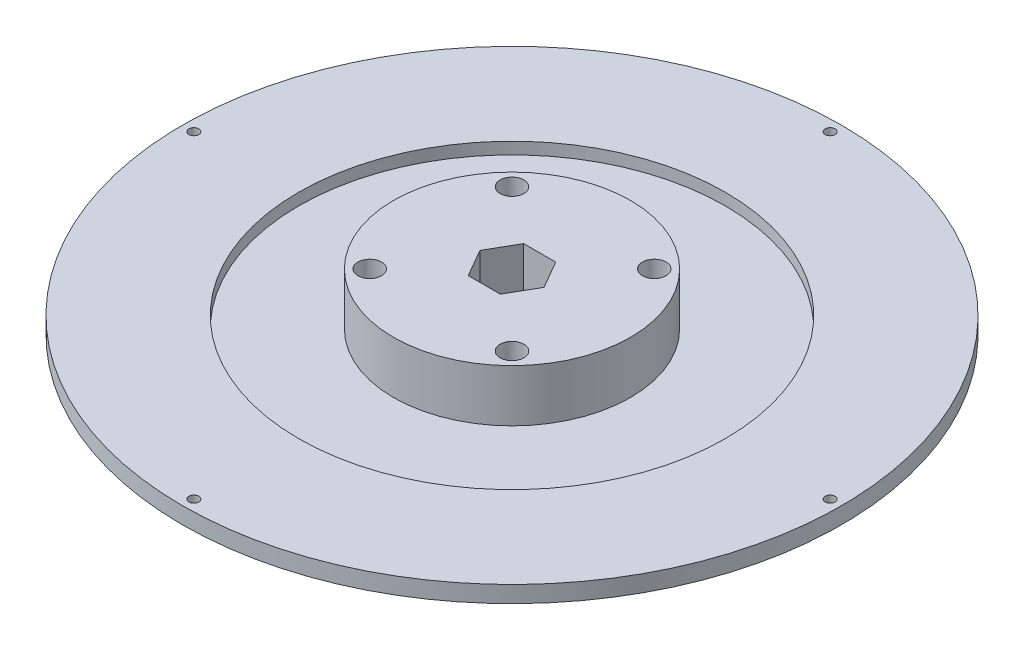
ISO-10303-21;
HEADER;
FILE_DESCRIPTION(('STEP AP214'),'2;1');
FILE_NAME('part.step','',(''),(''),'','','');
FILE_SCHEMA(('AUTOMOTIVE_DESIGN { 1 0 10303 214 1 1 1 1 }'));
ENDSEC;
DATA;
#1=APPLICATION_CONTEXT('core data for automotive mechanical design processes');
#2=APPLICATION_PROTOCOL_DEFINITION('international standard','automotive_design',2000,#1);
#3=PRODUCT_CONTEXT('',#1,'mechanical');
#4=PRODUCT('Part','Part','',(#3));
#5=PRODUCT_RELATED_PRODUCT_CATEGORY('part','',(#4));
#6=PRODUCT_DEFINITION_FORMATION('','',#4);
#7=PRODUCT_DEFINITION_CONTEXT('part definition',#1,'design');
#8=PRODUCT_DEFINITION('design','',#6,#7);
#9=PRODUCT_DEFINITION_SHAPE('','',#8);
#10=(LENGTH_UNIT() NAMED_UNIT(*) SI_UNIT(.MILLI.,.METRE.));
#11=(NAMED_UNIT(*) PLANE_ANGLE_UNIT() SI_UNIT($,.RADIAN.));
#12=(NAMED_UNIT(*) SI_UNIT($,.STERADIAN.) SOLID_ANGLE_UNIT());
#13=UNCERTAINTY_MEASURE_WITH_UNIT(LENGTH_MEASURE(1.E-05),#10,'distance_accuracy_value','');
#14=(GEOMETRIC_REPRESENTATION_CONTEXT(3) GLOBAL_UNCERTAINTY_ASSIGNED_CONTEXT((#13)) GLOBAL_UNIT_ASSIGNED_CONTEXT((#10,
#11,#12)) REPRESENTATION_CONTEXT('',''));
#15=CARTESIAN_POINT('',(0.,0.,0.));
#16=DIRECTION('',(0.,0.,1.));
#17=DIRECTION('',(1.,0.,0.));
#18=AXIS2_PLACEMENT_3D('',#15,#16,#17);
#19=CARTESIAN_POINT('',(0.,6.,0.));
#20=DIRECTION('',(0.,1.,0.));
#21=DIRECTION('',(0.,0.,1.));
#22=AXIS2_PLACEMENT_3D('',#19,#20,#21);
#23=CYLINDRICAL_SURFACE('',#22,69.5);
#24=CARTESIAN_POINT('',(0.,11.,0.));
#25=DIRECTION('',(0.,1.,0.));
#26=DIRECTION('',(0.,0.,1.));
#27=AXIS2_PLACEMENT_3D('',#24,#25,#26);
#28=CIRCLE('',#27,69.5);
#29=CARTESIAN_POINT('',(0.,11.,69.5));
#30=VERTEX_POINT('',#29);
#31=EDGE_CURVE('E191',#30,#30,#28,.T.);
#32=ORIENTED_EDGE('',*,*,#31,.T.);
#33=EDGE_LOOP('',(#32));
#34=FACE_BOUND('',#33,.T.);
#35=CARTESIAN_POINT('',(0.,14.5,0.));
#36=DIRECTION('',(0.,1.,0.));
#37=DIRECTION('',(0.,0.,1.));
#38=AXIS2_PLACEMENT_3D('',#35,#36,#37);
#39=CIRCLE('',#38,69.5);
#40=CARTESIAN_POINT('',(0.,14.5,69.5));
#41=VERTEX_POINT('',#40);
#42=EDGE_CURVE('E61',#41,#41,#39,.T.);
#43=ORIENTED_EDGE('',*,*,#42,.F.);
#44=EDGE_LOOP('',(#43));
#45=FACE_BOUND('',#44,.T.);
#46=ADVANCED_FACE('F50',(#34,#45),#23,.T.);
#47=CARTESIAN_POINT('',(0.,14.5,0.));
#48=DIRECTION('',(0.,1.,0.));
#49=DIRECTION('',(0.,0.,1.));
#50=AXIS2_PLACEMENT_3D('',#47,#48,#49);
#51=PLANE('',#50);
#52=CARTESIAN_POINT('',(-67.1,14.5,0.));
#53=DIRECTION('',(0.,1.,0.));
#54=DIRECTION('',(0.,0.,1.));
#55=AXIS2_PLACEMENT_3D('',#52,#53,#54);
#56=CIRCLE('',#55,1.04999999999999);
#57=CARTESIAN_POINT('',(-67.1,14.5,1.05));
#58=VERTEX_POINT('',#57);
#59=EDGE_CURVE('E192',#58,#58,#56,.T.);
#60=ORIENTED_EDGE('',*,*,#59,.F.);
#61=EDGE_LOOP('',(#60));
#62=FACE_BOUND('',#61,.T.);
#63=CARTESIAN_POINT('',(2.26061017814095E-13,14.5,-67.1));
#64=DIRECTION('',(0.,1.,0.));
#65=DIRECTION('',(0.,0.,1.));
#66=AXIS2_PLACEMENT_3D('',#63,#64,#65);
#67=CIRCLE('',#66,1.04999999999999);
#68=CARTESIAN_POINT('',(2.26061017814095E-13,14.5,-66.05));
#69=VERTEX_POINT('',#68);
#70=EDGE_CURVE('E200',#69,#69,#67,.T.);
#71=ORIENTED_EDGE('',*,*,#70,.F.);
#72=EDGE_LOOP('',(#71));
#73=FACE_BOUND('',#72,.T.);
#74=CARTESIAN_POINT('',(67.1,14.5,4.60339415650469E-13));
#75=DIRECTION('',(0.,1.,0.));
#76=DIRECTION('',(0.,0.,1.));
#77=AXIS2_PLACEMENT_3D('',#74,#75,#76);
#78=CIRCLE('',#77,1.04999999999999);
#79=CARTESIAN_POINT('',(67.1,14.5,1.05000000000045));
#80=VERTEX_POINT('',#79);
#81=EDGE_CURVE('E208',#80,#80,#78,.T.);
#82=ORIENTED_EDGE('',*,*,#81,.F.);
#83=EDGE_LOOP('',(#82));
#84=FACE_BOUND('',#83,.T.);
#85=CARTESIAN_POINT('',(-6.94617813486844E-13,14.5,67.1));
#86=DIRECTION('',(0.,1.,0.));
#87=DIRECTION('',(0.,0.,1.));
#88=AXIS2_PLACEMENT_3D('',#85,#86,#87);
#89=CIRCLE('',#88,1.04999999999999);
#90=CARTESIAN_POINT('',(-6.94617813486844E-13,14.5,68.15));
#91=VERTEX_POINT('',#90);
#92=EDGE_CURVE('E216',#91,#91,#89,.T.);
#93=ORIENTED_EDGE('',*,*,#92,.F.);
#94=EDGE_LOOP('',(#93));
#95=FACE_BOUND('',#94,.T.);
#96=ORIENTED_EDGE('',*,*,#42,.T.);
#97=EDGE_LOOP('',(#96));
#98=FACE_BOUND('',#97,.T.);
#99=CARTESIAN_POINT('',(0.,14.5,0.));
#100=DIRECTION('',(0.,1.,0.));
#101=DIRECTION('',(0.,0.,1.));
#102=AXIS2_PLACEMENT_3D('',#99,#100,#101);
#103=CIRCLE('',#102,45.);
#104=CARTESIAN_POINT('',(0.,14.5,45.));
#105=VERTEX_POINT('',#104);
#106=EDGE_CURVE('E220',#105,#105,#103,.T.);
#107=ORIENTED_EDGE('',*,*,#106,.F.);
#108=EDGE_LOOP('',(#107));
#109=FACE_BOUND('',#108,.T.);
#110=ADVANCED_FACE('F290',(#62,#73,#84,#95,#98,#109),#51,.T.);
#111=CARTESIAN_POINT('',(0.,14.,0.));
#112=DIRECTION('',(0.,-1.,0.));
#113=DIRECTION('',(0.,0.,-1.));
#114=AXIS2_PLACEMENT_3D('',#111,#112,#113);
#115=CYLINDRICAL_SURFACE('',#114,45.);
#116=ORIENTED_EDGE('',*,*,#106,.T.);
#117=EDGE_LOOP('',(#116));
#118=FACE_BOUND('',#117,.T.);
#119=CARTESIAN_POINT('',(0.,12.,0.));
#120=DIRECTION('',(0.,1.,0.));
#121=DIRECTION('',(0.,0.,1.));
#122=AXIS2_PLACEMENT_3D('',#119,#120,#121);
#123=CIRCLE('',#122,45.);
#124=CARTESIAN_POINT('',(0.,12.,45.));
#125=VERTEX_POINT('',#124);
#126=EDGE_CURVE('E12',#125,#125,#123,.F.);
#127=ORIENTED_EDGE('',*,*,#126,.T.);
#128=EDGE_LOOP('',(#127));
#129=FACE_BOUND('',#128,.T.);
#130=ADVANCED_FACE('F285',(#118,#129),#115,.F.);
#131=CARTESIAN_POINT('',(0.,12.,0.));
#132=DIRECTION('',(0.,1.,0.));
#133=DIRECTION('',(0.,0.,1.));
#134=AXIS2_PLACEMENT_3D('',#131,#132,#133);
#135=PLANE('',#134);
#136=CARTESIAN_POINT('',(0.,12.,0.));
#137=DIRECTION('',(0.,1.,0.));
#138=DIRECTION('',(0.,0.,1.));
#139=AXIS2_PLACEMENT_3D('',#136,#137,#138);
#140=CIRCLE('',#139,25.);
#141=CARTESIAN_POINT('',(0.,12.,25.));
#142=VERTEX_POINT('',#141);
#143=EDGE_CURVE('E177',#142,#142,#140,.T.);
#144=ORIENTED_EDGE('',*,*,#143,.F.);
#145=EDGE_LOOP('',(#144));
#146=FACE_BOUND('',#145,.T.);
#147=ORIENTED_EDGE('',*,*,#126,.F.);
#148=EDGE_LOOP('',(#147));
#149=FACE_BOUND('',#148,.T.);
#150=ADVANCED_FACE('F282',(#146,#149),#135,.T.);
#151=CARTESIAN_POINT('',(0.,11.,0.));
#152=DIRECTION('',(0.,1.,0.));
#153=DIRECTION('',(0.,0.,1.));
#154=AXIS2_PLACEMENT_3D('',#151,#152,#153);
#155=PLANE('',#154);
#156=DIRECTION('',(0.5,0.,-0.866025403784439));
#157=VECTOR('',#156,1.);
#158=CARTESIAN_POINT('',(5.06624861213896,11.,2.925));
#159=LINE('',#158,#157);
#160=CARTESIAN_POINT('',(3.3774990747593,11.,5.85));
#161=VERTEX_POINT('',#160);
#162=CARTESIAN_POINT('',(6.75499814951861,11.,0.));
#163=VERTEX_POINT('',#162);
#164=EDGE_CURVE('E117',#161,#163,#159,.T.);
#165=ORIENTED_EDGE('',*,*,#164,.T.);
#166=DIRECTION('',(-0.499999999999999,0.,-0.866025403784439));
#167=VECTOR('',#166,1.);
#168=CARTESIAN_POINT('',(5.06624861213896,11.,-2.92499999999999));
#169=LINE('',#168,#167);
#170=CARTESIAN_POINT('',(3.37749907475931,11.,-5.85));
#171=VERTEX_POINT('',#170);
#172=EDGE_CURVE('E108',#163,#171,#169,.T.);
#173=ORIENTED_EDGE('',*,*,#172,.T.);
#174=DIRECTION('',(-1.,0.,0.));
#175=VECTOR('',#174,1.);
#176=CARTESIAN_POINT('',(0.,11.,-5.85));
#177=LINE('',#176,#175);
#178=CARTESIAN_POINT('',(-3.37749907475931,11.,-5.85));
#179=VERTEX_POINT('',#178);
#180=EDGE_CURVE('E120',#171,#179,#177,.T.);
#181=ORIENTED_EDGE('',*,*,#180,.T.);
#182=DIRECTION('',(-0.5,0.,0.866025403784439));
#183=VECTOR('',#182,1.);
#184=CARTESIAN_POINT('',(-5.06624861213897,11.,-2.925));
#185=LINE('',#184,#183);
#186=CARTESIAN_POINT('',(-6.75499814951862,11.,0.));
#187=VERTEX_POINT('',#186);
#188=EDGE_CURVE('E70',#179,#187,#185,.T.);
#189=ORIENTED_EDGE('',*,*,#188,.T.);
#190=DIRECTION('',(0.499999999999999,0.,0.866025403784439));
#191=VECTOR('',#190,1.);
#192=CARTESIAN_POINT('',(-5.06624861213897,11.,2.925));
#193=LINE('',#192,#191);
#194=CARTESIAN_POINT('',(-3.37749907475932,11.,5.85));
#195=VERTEX_POINT('',#194);
#196=EDGE_CURVE('E139',#187,#195,#193,.T.);
#197=ORIENTED_EDGE('',*,*,#196,.T.);
#198=DIRECTION('',(1.,0.,0.));
#199=VECTOR('',#198,1.);
#200=CARTESIAN_POINT('',(0.,11.,5.85));
#201=LINE('',#200,#199);
#202=EDGE_CURVE('E244',#195,#161,#201,.T.);
#203=ORIENTED_EDGE('',*,*,#202,.T.);
#204=EDGE_LOOP('',(#165,#173,#181,#189,#197,#203));
#205=FACE_BOUND('',#204,.T.);
#206=CARTESIAN_POINT('',(-15.,11.,15.));
#207=DIRECTION('',(0.,1.,0.));
#208=DIRECTION('',(0.,0.,1.));
#209=AXIS2_PLACEMENT_3D('',#206,#207,#208);
#210=CIRCLE('',#209,2.5000000000002);
#211=CARTESIAN_POINT('',(-15.,11.,17.5000000000002));
#212=VERTEX_POINT('',#211);
#213=EDGE_CURVE('E160',#212,#212,#210,.T.);
#214=ORIENTED_EDGE('',*,*,#213,.T.);
#215=EDGE_LOOP('',(#214));
#216=FACE_BOUND('',#215,.T.);
#217=CARTESIAN_POINT('',(15.,11.,15.));
#218=DIRECTION('',(0.,1.,0.));
#219=DIRECTION('',(0.,0.,1.));
#220=AXIS2_PLACEMENT_3D('',#217,#218,#219);
#221=CIRCLE('',#220,2.50000000000014);
#222=CARTESIAN_POINT('',(15.,11.,17.5000000000001));
#223=VERTEX_POINT('',#222);
#224=EDGE_CURVE('E159',#223,#223,#221,.T.);
#225=ORIENTED_EDGE('',*,*,#224,.T.);
#226=EDGE_LOOP('',(#225));
#227=FACE_BOUND('',#226,.T.);
#228=CARTESIAN_POINT('',(15.,11.,-15.));
#229=DIRECTION('',(0.,1.,0.));
#230=DIRECTION('',(0.,0.,1.));
#231=AXIS2_PLACEMENT_3D('',#228,#229,#230);
#232=CIRCLE('',#231,2.50000000000006);
#233=CARTESIAN_POINT('',(15.,11.,-12.4999999999999));
#234=VERTEX_POINT('',#233);
#235=EDGE_CURVE('E165',#234,#234,#232,.T.);
#236=ORIENTED_EDGE('',*,*,#235,.T.);
#237=EDGE_LOOP('',(#236));
#238=FACE_BOUND('',#237,.T.);
#239=CARTESIAN_POINT('',(-15.,11.,-15.));
#240=DIRECTION('',(0.,1.,0.));
#241=DIRECTION('',(0.,0.,1.));
#242=AXIS2_PLACEMENT_3D('',#239,#240,#241);
#243=CIRCLE('',#242,2.5);
#244=CARTESIAN_POINT('',(-15.,11.,-12.5));
#245=VERTEX_POINT('',#244);
#246=EDGE_CURVE('E172',#245,#245,#243,.T.);
#247=ORIENTED_EDGE('',*,*,#246,.T.);
#248=EDGE_LOOP('',(#247));
#249=FACE_BOUND('',#248,.T.);
#250=CARTESIAN_POINT('',(-67.1,11.,0.));
#251=DIRECTION('',(0.,1.,0.));
#252=DIRECTION('',(0.,0.,1.));
#253=AXIS2_PLACEMENT_3D('',#250,#251,#252);
#254=CIRCLE('',#253,1.04999999999999);
#255=CARTESIAN_POINT('',(-67.1,11.,1.05));
#256=VERTEX_POINT('',#255);
#257=EDGE_CURVE('E187',#256,#256,#254,.T.);
#258=ORIENTED_EDGE('',*,*,#257,.T.);
#259=EDGE_LOOP('',(#258));
#260=FACE_BOUND('',#259,.T.);
#261=CARTESIAN_POINT('',(2.26061017814095E-13,11.,-67.1));
#262=DIRECTION('',(0.,1.,0.));
#263=DIRECTION('',(0.,0.,1.));
#264=AXIS2_PLACEMENT_3D('',#261,#262,#263);
#265=CIRCLE('',#264,1.04999999999999);
#266=CARTESIAN_POINT('',(2.26061017814095E-13,11.,-66.05));
#267=VERTEX_POINT('',#266);
#268=EDGE_CURVE('E196',#267,#267,#265,.T.);
#269=ORIENTED_EDGE('',*,*,#268,.T.);
#270=EDGE_LOOP('',(#269));
#271=FACE_BOUND('',#270,.T.);
#272=CARTESIAN_POINT('',(67.1,11.,4.60339415650469E-13));
#273=DIRECTION('',(0.,1.,0.));
#274=DIRECTION('',(0.,0.,1.));
#275=AXIS2_PLACEMENT_3D('',#272,#273,#274);
#276=CIRCLE('',#275,1.04999999999999);
#277=CARTESIAN_POINT('',(67.1,11.,1.05000000000045));
#278=VERTEX_POINT('',#277);
#279=EDGE_CURVE('E204',#278,#278,#276,.T.);
#280=ORIENTED_EDGE('',*,*,#279,.T.);
#281=EDGE_LOOP('',(#280));
#282=FACE_BOUND('',#281,.T.);
#283=CARTESIAN_POINT('',(-6.94617813486844E-13,11.,67.1));
#284=DIRECTION('',(0.,1.,0.));
#285=DIRECTION('',(0.,0.,1.));
#286=AXIS2_PLACEMENT_3D('',#283,#284,#285);
#287=CIRCLE('',#286,1.04999999999999);
#288=CARTESIAN_POINT('',(-6.94617813486844E-13,11.,68.15));
#289=VERTEX_POINT('',#288);
#290=EDGE_CURVE('E212',#289,#289,#287,.T.);
#291=ORIENTED_EDGE('',*,*,#290,.T.);
#292=EDGE_LOOP('',(#291));
#293=FACE_BOUND('',#292,.T.);
#294=ORIENTED_EDGE('',*,*,#31,.F.);
#295=EDGE_LOOP('',(#294));
#296=FACE_BOUND('',#295,.T.);
#297=ADVANCED_FACE('F125',(#205,#216,#227,#238,#249,#260,#271,#282,#293,#296),#155,.F.);
#298=CARTESIAN_POINT('',(-6.94617813486844E-13,11.,67.1));
#299=DIRECTION('',(0.,1.,0.));
#300=DIRECTION('',(0.,0.,1.));
#301=AXIS2_PLACEMENT_3D('',#298,#299,#300);
#302=CYLINDRICAL_SURFACE('',#301,1.04999999999999);
#303=ORIENTED_EDGE('',*,*,#290,.F.);
#304=EDGE_LOOP('',(#303));
#305=FACE_BOUND('',#304,.T.);
#306=ORIENTED_EDGE('',*,*,#92,.T.);
#307=EDGE_LOOP('',(#306));
#308=FACE_BOUND('',#307,.T.);
#309=ADVANCED_FACE('F387',(#305,#308),#302,.F.);
#310=CARTESIAN_POINT('',(67.1,11.,4.60339415650469E-13));
#311=DIRECTION('',(0.,1.,0.));
#312=DIRECTION('',(0.,0.,1.));
#313=AXIS2_PLACEMENT_3D('',#310,#311,#312);
#314=CYLINDRICAL_SURFACE('',#313,1.04999999999999);
#315=ORIENTED_EDGE('',*,*,#279,.F.);
#316=EDGE_LOOP('',(#315));
#317=FACE_BOUND('',#316,.T.);
#318=ORIENTED_EDGE('',*,*,#81,.T.);
#319=EDGE_LOOP('',(#318));
#320=FACE_BOUND('',#319,.T.);
#321=ADVANCED_FACE('F421',(#317,#320),#314,.F.);
#322=CARTESIAN_POINT('',(2.26061017814095E-13,11.,-67.1));
#323=DIRECTION('',(0.,1.,0.));
#324=DIRECTION('',(0.,0.,1.));
#325=AXIS2_PLACEMENT_3D('',#322,#323,#324);
#326=CYLINDRICAL_SURFACE('',#325,1.04999999999999);
#327=ORIENTED_EDGE('',*,*,#268,.F.);
#328=EDGE_LOOP('',(#327));
#329=FACE_BOUND('',#328,.T.);
#330=ORIENTED_EDGE('',*,*,#70,.T.);
#331=EDGE_LOOP('',(#330));
#332=FACE_BOUND('',#331,.T.);
#333=ADVANCED_FACE('F431',(#329,#332),#326,.F.);
#334=CARTESIAN_POINT('',(-67.1,11.,0.));
#335=DIRECTION('',(0.,1.,0.));
#336=DIRECTION('',(0.,0.,1.));
#337=AXIS2_PLACEMENT_3D('',#334,#335,#336);
#338=CYLINDRICAL_SURFACE('',#337,1.04999999999999);
#339=ORIENTED_EDGE('',*,*,#257,.F.);
#340=EDGE_LOOP('',(#339));
#341=FACE_BOUND('',#340,.T.);
#342=ORIENTED_EDGE('',*,*,#59,.T.);
#343=EDGE_LOOP('',(#342));
#344=FACE_BOUND('',#343,.T.);
#345=ADVANCED_FACE('F278',(#341,#344),#338,.F.);
#346=CARTESIAN_POINT('',(0.,19.,0.));
#347=DIRECTION('',(0.,-1.,0.));
#348=DIRECTION('',(0.,0.,-1.));
#349=AXIS2_PLACEMENT_3D('',#346,#347,#348);
#350=CYLINDRICAL_SURFACE('',#349,25.);
#351=CARTESIAN_POINT('',(0.,23.,0.));
#352=DIRECTION('',(0.,1.,0.));
#353=DIRECTION('',(0.,0.,1.));
#354=AXIS2_PLACEMENT_3D('',#351,#352,#353);
#355=CIRCLE('',#354,25.);
#356=CARTESIAN_POINT('',(0.,23.,25.));
#357=VERTEX_POINT('',#356);
#358=EDGE_CURVE('E54',#357,#357,#355,.T.);
#359=ORIENTED_EDGE('',*,*,#358,.F.);
#360=EDGE_LOOP('',(#359));
#361=FACE_BOUND('',#360,.T.);
#362=ORIENTED_EDGE('',*,*,#143,.T.);
#363=EDGE_LOOP('',(#362));
#364=FACE_BOUND('',#363,.T.);
#365=ADVANCED_FACE('F269',(#361,#364),#350,.T.);
#366=CARTESIAN_POINT('',(0.,23.,0.));
#367=DIRECTION('',(0.,1.,0.));
#368=DIRECTION('',(0.,0.,1.));
#369=AXIS2_PLACEMENT_3D('',#366,#367,#368);
#370=PLANE('',#369);
#371=DIRECTION('',(-0.499999999999999,0.,-0.866025403784439));
#372=VECTOR('',#371,1.);
#373=CARTESIAN_POINT('',(5.06624861213897,23.,-2.92499999999999));
#374=LINE('',#373,#372);
#375=CARTESIAN_POINT('',(6.75499814951861,23.,0.));
#376=VERTEX_POINT('',#375);
#377=CARTESIAN_POINT('',(3.37749907475931,23.,-5.85));
#378=VERTEX_POINT('',#377);
#379=EDGE_CURVE('E111',#376,#378,#374,.T.);
#380=ORIENTED_EDGE('',*,*,#379,.F.);
#381=DIRECTION('',(0.5,0.,-0.866025403784439));
#382=VECTOR('',#381,1.);
#383=CARTESIAN_POINT('',(5.06624861213896,23.,2.925));
#384=LINE('',#383,#382);
#385=CARTESIAN_POINT('',(3.3774990747593,23.,5.85));
#386=VERTEX_POINT('',#385);
#387=EDGE_CURVE('E129',#386,#376,#384,.T.);
#388=ORIENTED_EDGE('',*,*,#387,.F.);
#389=DIRECTION('',(1.,0.,0.));
#390=VECTOR('',#389,1.);
#391=CARTESIAN_POINT('',(0.,23.,5.85));
#392=LINE('',#391,#390);
#393=CARTESIAN_POINT('',(-3.37749907475932,23.,5.85));
#394=VERTEX_POINT('',#393);
#395=EDGE_CURVE('E132',#394,#386,#392,.T.);
#396=ORIENTED_EDGE('',*,*,#395,.F.);
#397=DIRECTION('',(0.499999999999999,0.,0.866025403784439));
#398=VECTOR('',#397,1.);
#399=CARTESIAN_POINT('',(-5.06624861213897,23.,2.925));
#400=LINE('',#399,#398);
#401=CARTESIAN_POINT('',(-6.75499814951862,23.,0.));
#402=VERTEX_POINT('',#401);
#403=EDGE_CURVE('E149',#402,#394,#400,.T.);
#404=ORIENTED_EDGE('',*,*,#403,.F.);
#405=DIRECTION('',(-0.5,0.,0.866025403784439));
#406=VECTOR('',#405,1.);
#407=CARTESIAN_POINT('',(-5.06624861213897,23.,-2.925));
#408=LINE('',#407,#406);
#409=CARTESIAN_POINT('',(-3.37749907475931,23.,-5.85));
#410=VERTEX_POINT('',#409);
#411=EDGE_CURVE('E145',#410,#402,#408,.T.);
#412=ORIENTED_EDGE('',*,*,#411,.F.);
#413=DIRECTION('',(-1.,0.,0.));
#414=VECTOR('',#413,1.);
#415=CARTESIAN_POINT('',(0.,23.,-5.85));
#416=LINE('',#415,#414);
#417=EDGE_CURVE('E142',#378,#410,#416,.T.);
#418=ORIENTED_EDGE('',*,*,#417,.F.);
#419=EDGE_LOOP('',(#380,#388,#396,#404,#412,#418));
#420=FACE_BOUND('',#419,.T.);
#421=CARTESIAN_POINT('',(-15.,23.,15.));
#422=DIRECTION('',(0.,1.,0.));
#423=DIRECTION('',(0.,0.,1.));
#424=AXIS2_PLACEMENT_3D('',#421,#422,#423);
#425=CIRCLE('',#424,2.5000000000002);
#426=CARTESIAN_POINT('',(-15.,23.,17.5000000000002));
#427=VERTEX_POINT('',#426);
#428=EDGE_CURVE('E155',#427,#427,#425,.T.);
#429=ORIENTED_EDGE('',*,*,#428,.F.);
#430=EDGE_LOOP('',(#429));
#431=FACE_BOUND('',#430,.T.);
#432=CARTESIAN_POINT('',(15.,23.,15.));
#433=DIRECTION('',(0.,1.,0.));
#434=DIRECTION('',(0.,0.,1.));
#435=AXIS2_PLACEMENT_3D('',#432,#433,#434);
#436=CIRCLE('',#435,2.50000000000014);
#437=CARTESIAN_POINT('',(15.,23.,17.5000000000001));
#438=VERTEX_POINT('',#437);
#439=EDGE_CURVE('E161',#438,#438,#436,.T.);
#440=ORIENTED_EDGE('',*,*,#439,.F.);
#441=EDGE_LOOP('',(#440));
#442=FACE_BOUND('',#441,.T.);
#443=CARTESIAN_POINT('',(15.,23.,-15.));
#444=DIRECTION('',(0.,1.,0.));
#445=DIRECTION('',(0.,0.,1.));
#446=AXIS2_PLACEMENT_3D('',#443,#444,#445);
#447=CIRCLE('',#446,2.50000000000006);
#448=CARTESIAN_POINT('',(15.,23.,-12.4999999999999));
#449=VERTEX_POINT('',#448);
#450=EDGE_CURVE('E166',#449,#449,#447,.T.);
#451=ORIENTED_EDGE('',*,*,#450,.F.);
#452=EDGE_LOOP('',(#451));
#453=FACE_BOUND('',#452,.T.);
#454=CARTESIAN_POINT('',(-15.,23.,-15.));
#455=DIRECTION('',(0.,1.,0.));
#456=DIRECTION('',(0.,0.,1.));
#457=AXIS2_PLACEMENT_3D('',#454,#455,#456);
#458=CIRCLE('',#457,2.5);
#459=CARTESIAN_POINT('',(-15.,23.,-12.5));
#460=VERTEX_POINT('',#459);
#461=EDGE_CURVE('E169',#460,#460,#458,.T.);
#462=ORIENTED_EDGE('',*,*,#461,.F.);
#463=EDGE_LOOP('',(#462));
#464=FACE_BOUND('',#463,.T.);
#465=ORIENTED_EDGE('',*,*,#358,.T.);
#466=EDGE_LOOP('',(#465));
#467=FACE_BOUND('',#466,.T.);
#468=ADVANCED_FACE('F52',(#420,#431,#442,#453,#464,#467),#370,.T.);
#469=CARTESIAN_POINT('',(-15.,11.,-15.));
#470=DIRECTION('',(0.,1.,0.));
#471=DIRECTION('',(0.,0.,1.));
#472=AXIS2_PLACEMENT_3D('',#469,#470,#471);
#473=CYLINDRICAL_SURFACE('',#472,2.5);
#474=ORIENTED_EDGE('',*,*,#246,.F.);
#475=EDGE_LOOP('',(#474));
#476=FACE_BOUND('',#475,.T.);
#477=ORIENTED_EDGE('',*,*,#461,.T.);
#478=EDGE_LOOP('',(#477));
#479=FACE_BOUND('',#478,.T.);
#480=ADVANCED_FACE('F263',(#476,#479),#473,.F.);
#481=CARTESIAN_POINT('',(15.,11.,-15.));
#482=DIRECTION('',(0.,1.,0.));
#483=DIRECTION('',(0.,0.,1.));
#484=AXIS2_PLACEMENT_3D('',#481,#482,#483);
#485=CYLINDRICAL_SURFACE('',#484,2.50000000000006);
#486=ORIENTED_EDGE('',*,*,#235,.F.);
#487=EDGE_LOOP('',(#486));
#488=FACE_BOUND('',#487,.T.);
#489=ORIENTED_EDGE('',*,*,#450,.T.);
#490=EDGE_LOOP('',(#489));
#491=FACE_BOUND('',#490,.T.);
#492=ADVANCED_FACE('F259',(#488,#491),#485,.F.);
#493=CARTESIAN_POINT('',(15.,11.,15.));
#494=DIRECTION('',(0.,1.,0.));
#495=DIRECTION('',(0.,0.,1.));
#496=AXIS2_PLACEMENT_3D('',#493,#494,#495);
#497=CYLINDRICAL_SURFACE('',#496,2.50000000000014);
#498=ORIENTED_EDGE('',*,*,#224,.F.);
#499=EDGE_LOOP('',(#498));
#500=FACE_BOUND('',#499,.T.);
#501=ORIENTED_EDGE('',*,*,#439,.T.);
#502=EDGE_LOOP('',(#501));
#503=FACE_BOUND('',#502,.T.);
#504=ADVANCED_FACE('F262',(#500,#503),#497,.F.);
#505=CARTESIAN_POINT('',(-15.,11.,15.));
#506=DIRECTION('',(0.,1.,0.));
#507=DIRECTION('',(0.,0.,1.));
#508=AXIS2_PLACEMENT_3D('',#505,#506,#507);
#509=CYLINDRICAL_SURFACE('',#508,2.5000000000002);
#510=ORIENTED_EDGE('',*,*,#213,.F.);
#511=EDGE_LOOP('',(#510));
#512=FACE_BOUND('',#511,.T.);
#513=ORIENTED_EDGE('',*,*,#428,.T.);
#514=EDGE_LOOP('',(#513));
#515=FACE_BOUND('',#514,.T.);
#516=ADVANCED_FACE('F323',(#512,#515),#509,.F.);
#517=CARTESIAN_POINT('',(6.69726312259965,11.,-0.0999999999999963));
#518=DIRECTION('',(0.866025403784439,0.,-0.499999999999999));
#519=DIRECTION('',(-0.499999999999999,0.,-0.866025403784439));
#520=AXIS2_PLACEMENT_3D('',#517,#518,#519);
#521=PLANE('',#520);
#522=ORIENTED_EDGE('',*,*,#379,.T.);
#523=DIRECTION('',(0.,1.,0.));
#524=VECTOR('',#523,1.);
#525=CARTESIAN_POINT('',(3.37749907475931,11.,-5.85));
#526=LINE('',#525,#524);
#527=EDGE_CURVE('E104',#171,#378,#526,.T.);
#528=ORIENTED_EDGE('',*,*,#527,.F.);
#529=ORIENTED_EDGE('',*,*,#172,.F.);
#530=DIRECTION('',(0.,1.,0.));
#531=VECTOR('',#530,1.);
#532=CARTESIAN_POINT('',(6.75499814951861,11.,0.));
#533=LINE('',#532,#531);
#534=EDGE_CURVE('E101',#163,#376,#533,.T.);
#535=ORIENTED_EDGE('',*,*,#534,.T.);
#536=EDGE_LOOP('',(#522,#528,#529,#535));
#537=FACE_BOUND('',#536,.T.);
#538=ADVANCED_FACE('F106',(#537),#521,.F.);
#539=CARTESIAN_POINT('',(6.69726312259965,11.,0.100000000000003));
#540=DIRECTION('',(0.866025403784439,0.,0.5));
#541=DIRECTION('',(0.5,0.,-0.866025403784439));
#542=AXIS2_PLACEMENT_3D('',#539,#540,#541);
#543=PLANE('',#542);
#544=ORIENTED_EDGE('',*,*,#387,.T.);
#545=ORIENTED_EDGE('',*,*,#534,.F.);
#546=ORIENTED_EDGE('',*,*,#164,.F.);
#547=DIRECTION('',(0.,1.,0.));
#548=VECTOR('',#547,1.);
#549=CARTESIAN_POINT('',(3.3774990747593,11.,5.85));
#550=LINE('',#549,#548);
#551=EDGE_CURVE('E95',#161,#386,#550,.T.);
#552=ORIENTED_EDGE('',*,*,#551,.T.);
#553=EDGE_LOOP('',(#544,#545,#546,#552));
#554=FACE_BOUND('',#553,.T.);
#555=ADVANCED_FACE('F317',(#554),#543,.F.);
#556=CARTESIAN_POINT('',(-3.26202902092139,11.,5.85));
#557=DIRECTION('',(0.,0.,1.));
#558=DIRECTION('',(1.,0.,0.));
#559=AXIS2_PLACEMENT_3D('',#556,#557,#558);
#560=PLANE('',#559);
#561=ORIENTED_EDGE('',*,*,#395,.T.);
#562=ORIENTED_EDGE('',*,*,#551,.F.);
#563=ORIENTED_EDGE('',*,*,#202,.F.);
#564=DIRECTION('',(0.,1.,0.));
#565=VECTOR('',#564,1.);
#566=CARTESIAN_POINT('',(-3.37749907475932,11.,5.85));
#567=LINE('',#566,#565);
#568=EDGE_CURVE('E230',#195,#394,#567,.T.);
#569=ORIENTED_EDGE('',*,*,#568,.T.);
#570=EDGE_LOOP('',(#561,#562,#563,#569));
#571=FACE_BOUND('',#570,.T.);
#572=ADVANCED_FACE('F313',(#571),#560,.F.);
#573=CARTESIAN_POINT('',(-3.43523410167828,11.,5.75));
#574=DIRECTION('',(-0.866025403784439,0.,0.499999999999999));
#575=DIRECTION('',(0.499999999999999,0.,0.866025403784439));
#576=AXIS2_PLACEMENT_3D('',#573,#574,#575);
#577=PLANE('',#576);
#578=ORIENTED_EDGE('',*,*,#403,.T.);
#579=ORIENTED_EDGE('',*,*,#568,.F.);
#580=ORIENTED_EDGE('',*,*,#196,.F.);
#581=DIRECTION('',(0.,1.,0.));
#582=VECTOR('',#581,1.);
#583=CARTESIAN_POINT('',(-6.75499814951862,11.,0.));
#584=LINE('',#583,#582);
#585=EDGE_CURVE('E233',#187,#402,#584,.T.);
#586=ORIENTED_EDGE('',*,*,#585,.T.);
#587=EDGE_LOOP('',(#578,#579,#580,#586));
#588=FACE_BOUND('',#587,.T.);
#589=ADVANCED_FACE('F309',(#588),#577,.F.);
#590=CARTESIAN_POINT('',(-3.43523410167827,11.,-5.75));
#591=DIRECTION('',(-0.866025403784439,0.,-0.5));
#592=DIRECTION('',(-0.5,0.,0.866025403784439));
#593=AXIS2_PLACEMENT_3D('',#590,#591,#592);
#594=PLANE('',#593);
#595=ORIENTED_EDGE('',*,*,#411,.T.);
#596=ORIENTED_EDGE('',*,*,#585,.F.);
#597=ORIENTED_EDGE('',*,*,#188,.F.);
#598=DIRECTION('',(0.,1.,0.));
#599=VECTOR('',#598,1.);
#600=CARTESIAN_POINT('',(-3.37749907475931,11.,-5.85));
#601=LINE('',#600,#599);
#602=EDGE_CURVE('E116',#179,#410,#601,.T.);
#603=ORIENTED_EDGE('',*,*,#602,.T.);
#604=EDGE_LOOP('',(#595,#596,#597,#603));
#605=FACE_BOUND('',#604,.T.);
#606=ADVANCED_FACE('F312',(#605),#594,.F.);
#607=CARTESIAN_POINT('',(-3.26202902092138,11.,-5.85));
#608=DIRECTION('',(0.,0.,-1.));
#609=DIRECTION('',(-1.,0.,0.));
#610=AXIS2_PLACEMENT_3D('',#607,#608,#609);
#611=PLANE('',#610);
#612=ORIENTED_EDGE('',*,*,#417,.T.);
#613=ORIENTED_EDGE('',*,*,#602,.F.);
#614=ORIENTED_EDGE('',*,*,#180,.F.);
#615=ORIENTED_EDGE('',*,*,#527,.T.);
#616=EDGE_LOOP('',(#612,#613,#614,#615));
#617=FACE_BOUND('',#616,.T.);
#618=ADVANCED_FACE('F121',(#617),#611,.F.);
#619=CLOSED_SHELL('',(#46,#110,#130,#150,#297,#309,#321,#333,#345,#365,#468,#480,#492,#504,#516,
#538,#555,#572,#589,#606,#618));
#620=MANIFOLD_SOLID_BREP('B2',#619);
#621=ADVANCED_BREP_SHAPE_REPRESENTATION('',(#18,#620),#14);
#622=SHAPE_DEFINITION_REPRESENTATION(#9,#621);
ENDSEC;
END-ISO-10303-21;
